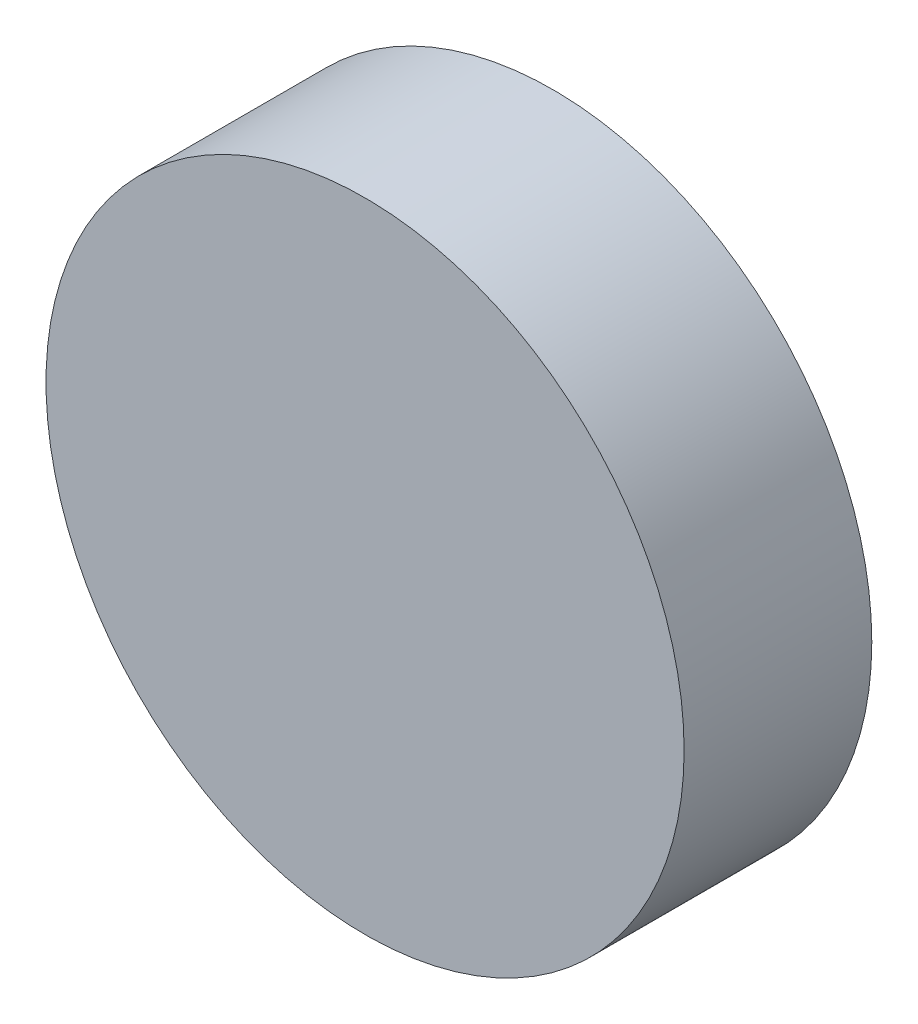
ISO-10303-21;
HEADER;
FILE_DESCRIPTION(('STEP AP214'),'2;1');
FILE_NAME('part.step','',(''),(''),'','','');
FILE_SCHEMA(('AUTOMOTIVE_DESIGN { 1 0 10303 214 1 1 1 1 }'));
ENDSEC;
DATA;
#1=APPLICATION_CONTEXT('core data for automotive mechanical design processes');
#2=APPLICATION_PROTOCOL_DEFINITION('international standard','automotive_design',2000,#1);
#3=PRODUCT_CONTEXT('',#1,'mechanical');
#4=PRODUCT('Part','Part','',(#3));
#5=PRODUCT_RELATED_PRODUCT_CATEGORY('part','',(#4));
#6=PRODUCT_DEFINITION_FORMATION('','',#4);
#7=PRODUCT_DEFINITION_CONTEXT('part definition',#1,'design');
#8=PRODUCT_DEFINITION('design','',#6,#7);
#9=PRODUCT_DEFINITION_SHAPE('','',#8);
#10=(LENGTH_UNIT() NAMED_UNIT(*) SI_UNIT(.MILLI.,.METRE.));
#11=(NAMED_UNIT(*) PLANE_ANGLE_UNIT() SI_UNIT($,.RADIAN.));
#12=(NAMED_UNIT(*) SI_UNIT($,.STERADIAN.) SOLID_ANGLE_UNIT());
#13=UNCERTAINTY_MEASURE_WITH_UNIT(LENGTH_MEASURE(1.E-05),#10,'distance_accuracy_value','');
#14=(GEOMETRIC_REPRESENTATION_CONTEXT(3) GLOBAL_UNCERTAINTY_ASSIGNED_CONTEXT((#13)) GLOBAL_UNIT_ASSIGNED_CONTEXT((#10,
#11,#12)) REPRESENTATION_CONTEXT('',''));
#15=CARTESIAN_POINT('',(0.,0.,0.));
#16=DIRECTION('',(0.,0.,1.));
#17=DIRECTION('',(1.,0.,0.));
#18=AXIS2_PLACEMENT_3D('',#15,#16,#17);
#19=CARTESIAN_POINT('',(0.,0.,5.));
#20=DIRECTION('',(0.,0.,-1.));
#21=DIRECTION('',(-1.,0.,0.));
#22=AXIS2_PLACEMENT_3D('',#19,#20,#21);
#23=CYLINDRICAL_SURFACE('',#22,8.5);
#24=CARTESIAN_POINT('',(0.,0.,5.));
#25=DIRECTION('',(0.,0.,1.));
#26=DIRECTION('',(1.,0.,0.));
#27=AXIS2_PLACEMENT_3D('',#24,#25,#26);
#28=CIRCLE('',#27,8.5);
#29=CARTESIAN_POINT('',(8.5,0.,5.));
#30=VERTEX_POINT('',#29);
#31=EDGE_CURVE('E10',#30,#30,#28,.T.);
#32=ORIENTED_EDGE('',*,*,#31,.F.);
#33=EDGE_LOOP('',(#32));
#34=FACE_BOUND('',#33,.T.);
#35=CARTESIAN_POINT('',(0.,0.,0.));
#36=DIRECTION('',(0.,0.,1.));
#37=DIRECTION('',(1.,0.,0.));
#38=AXIS2_PLACEMENT_3D('',#35,#36,#37);
#39=CIRCLE('',#38,8.5);
#40=CARTESIAN_POINT('',(8.5,0.,0.));
#41=VERTEX_POINT('',#40);
#42=EDGE_CURVE('E34',#41,#41,#39,.T.);
#43=ORIENTED_EDGE('',*,*,#42,.T.);
#44=EDGE_LOOP('',(#43));
#45=FACE_BOUND('',#44,.T.);
#46=ADVANCED_FACE('F31',(#34,#45),#23,.T.);
#47=CARTESIAN_POINT('',(0.,0.,5.));
#48=DIRECTION('',(0.,0.,1.));
#49=DIRECTION('',(1.,0.,0.));
#50=AXIS2_PLACEMENT_3D('',#47,#48,#49);
#51=PLANE('',#50);
#52=ORIENTED_EDGE('',*,*,#31,.T.);
#53=EDGE_LOOP('',(#52));
#54=FACE_BOUND('',#53,.T.);
#55=ADVANCED_FACE('F46',(#54),#51,.T.);
#56=CARTESIAN_POINT('',(0.,0.,0.));
#57=DIRECTION('',(0.,0.,1.));
#58=DIRECTION('',(1.,0.,0.));
#59=AXIS2_PLACEMENT_3D('',#56,#57,#58);
#60=PLANE('',#59);
#61=ORIENTED_EDGE('',*,*,#42,.F.);
#62=EDGE_LOOP('',(#61));
#63=FACE_BOUND('',#62,.T.);
#64=ADVANCED_FACE('F44',(#63),#60,.F.);
#65=CLOSED_SHELL('',(#46,#55,#64));
#66=MANIFOLD_SOLID_BREP('B2',#65);
#67=ADVANCED_BREP_SHAPE_REPRESENTATION('',(#18,#66),#14);
#68=SHAPE_DEFINITION_REPRESENTATION(#9,#67);
ENDSEC;
END-ISO-10303-21;
